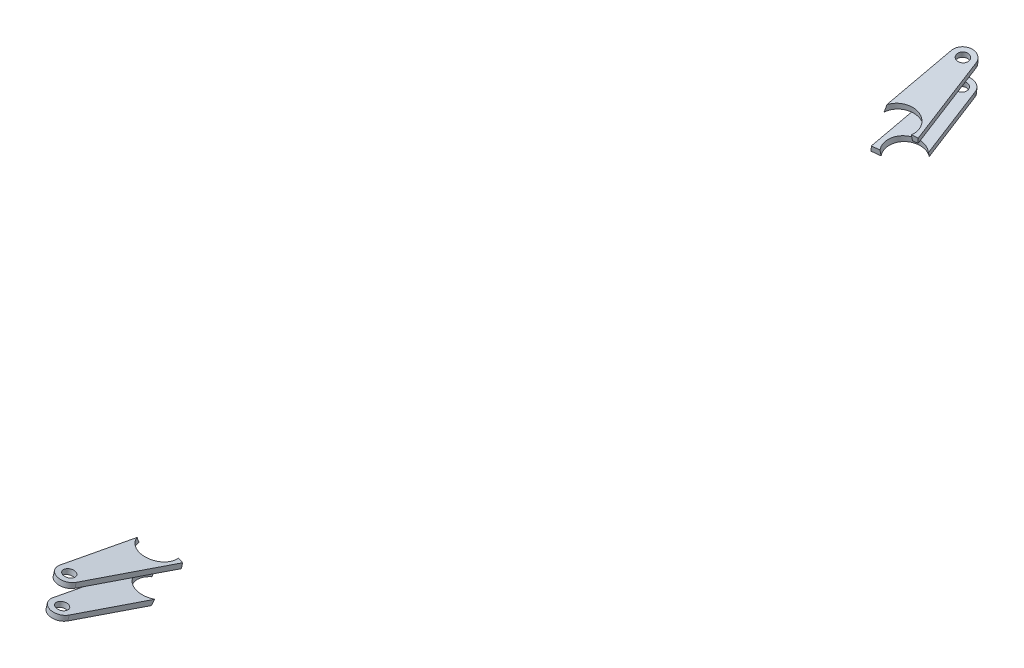
ISO-10303-21;
HEADER;
FILE_DESCRIPTION(('STEP AP214'),'2;1');
FILE_NAME('part.step','',(''),(''),'','','');
FILE_SCHEMA(('AUTOMOTIVE_DESIGN { 1 0 10303 214 1 1 1 1 }'));
ENDSEC;
DATA;
#1=APPLICATION_CONTEXT('core data for automotive mechanical design processes');
#2=APPLICATION_PROTOCOL_DEFINITION('international standard','automotive_design',2000,#1);
#3=PRODUCT_CONTEXT('',#1,'mechanical');
#4=PRODUCT('Part','Part','',(#3));
#5=PRODUCT_RELATED_PRODUCT_CATEGORY('part','',(#4));
#6=PRODUCT_DEFINITION_FORMATION('','',#4);
#7=PRODUCT_DEFINITION_CONTEXT('part definition',#1,'design');
#8=PRODUCT_DEFINITION('design','',#6,#7);
#9=PRODUCT_DEFINITION_SHAPE('','',#8);
#10=(LENGTH_UNIT() NAMED_UNIT(*) SI_UNIT(.MILLI.,.METRE.));
#11=(NAMED_UNIT(*) PLANE_ANGLE_UNIT() SI_UNIT($,.RADIAN.));
#12=(NAMED_UNIT(*) SI_UNIT($,.STERADIAN.) SOLID_ANGLE_UNIT());
#13=UNCERTAINTY_MEASURE_WITH_UNIT(LENGTH_MEASURE(1.E-05),#10,'distance_accuracy_value','');
#14=(GEOMETRIC_REPRESENTATION_CONTEXT(3) GLOBAL_UNCERTAINTY_ASSIGNED_CONTEXT((#13)) GLOBAL_UNIT_ASSIGNED_CONTEXT((#10,
#11,#12)) REPRESENTATION_CONTEXT('',''));
#15=CARTESIAN_POINT('',(0.,0.,0.));
#16=DIRECTION('',(0.,0.,1.));
#17=DIRECTION('',(1.,0.,0.));
#18=AXIS2_PLACEMENT_3D('',#15,#16,#17);
#19=CARTESIAN_POINT('',(-315.898608154601,39.6207972962913,-98.9370051373179));
#20=DIRECTION('',(0.949587650168119,-0.105104387132738,0.295358024190373));
#21=DIRECTION('',(-0.257678722373041,0.274943604623151,0.926287045312103));
#22=AXIS2_PLACEMENT_3D('',#19,#20,#21);
#23=PLANE('',#22);
#24=DIRECTION('',(0.280083660283906,-0.138831331262688,-0.949883679563872));
#25=VECTOR('',#24,1.);
#26=CARTESIAN_POINT('',(-315.33524059586,43.5596883671696,-99.3465831219716));
#27=LINE('',#26,#25);
#28=CARTESIAN_POINT('',(-444.781285392528,107.723255451357,339.660409330972));
#29=VERTEX_POINT('',#28);
#30=CARTESIAN_POINT('',(-430.15979927421,100.475705270145,290.072686074704));
#31=VERTEX_POINT('',#30);
#32=EDGE_CURVE('E53',#29,#31,#27,.T.);
#33=ORIENTED_EDGE('',*,*,#32,.F.);
#34=DIRECTION('',(0.140841889685417,0.984722767719566,-0.102394496163414));
#35=VECTOR('',#34,1.);
#36=CARTESIAN_POINT('',(-445.34465295127,103.784364380478,340.069987315625));
#37=LINE('',#36,#35);
#38=CARTESIAN_POINT('',(-445.34465295127,103.784364380478,340.069987315625));
#39=VERTEX_POINT('',#38);
#40=EDGE_CURVE('E123',#39,#29,#37,.T.);
#41=ORIENTED_EDGE('',*,*,#40,.F.);
#42=DIRECTION('',(0.280083660283906,-0.138831331262688,-0.949883679563872));
#43=VECTOR('',#42,1.);
#44=CARTESIAN_POINT('',(-315.898608154601,39.6207972962913,-98.9370051373179));
#45=LINE('',#44,#43);
#46=CARTESIAN_POINT('',(-431.055779689559,96.7016831017622,291.610296747108));
#47=VERTEX_POINT('',#46);
#48=EDGE_CURVE('E113',#39,#47,#45,.T.);
#49=ORIENTED_EDGE('',*,*,#48,.T.);
#50=CARTESIAN_POINT('',(-435.615739093965,47.9161448269677,288.910207701595));
#51=DIRECTION('',(-0.949587650168119,0.105104387132738,-0.295358024190373));
#52=DIRECTION('',(-0.139095636690416,-0.985567914832191,0.0964794750556549));
#53=AXIS2_PLACEMENT_3D('',#50,#51,#52);
#54=ELLIPSE('',#53,61.2064689207958,12.7);
#55=EDGE_CURVE('E121',#31,#47,#54,.F.);
#56=ORIENTED_EDGE('',*,*,#55,.F.);
#57=EDGE_LOOP('',(#33,#41,#49,#56));
#58=FACE_BOUND('',#57,.T.);
#59=ADVANCED_FACE('F50',(#58),#23,.T.);
#60=CARTESIAN_POINT('',(-452.941354152615,104.62519947754,337.707123122102));
#61=DIRECTION('',(0.140841889685417,0.984722767719566,-0.102394496163414));
#62=DIRECTION('',(0.989925947061876,-0.141586084533923,0.));
#63=AXIS2_PLACEMENT_3D('',#60,#61,#62);
#64=CYLINDRICAL_SURFACE('',#63,7.99999999999992);
#65=CARTESIAN_POINT('',(-452.377986593873,108.564090548419,337.297545137449));
#66=DIRECTION('',(-0.140841889685417,-0.984722767719566,0.102394496163414));
#67=DIRECTION('',(-0.989925947061876,0.141586084533923,0.));
#68=AXIS2_PLACEMENT_3D('',#65,#66,#67);
#69=CIRCLE('',#68,7.99999999999992);
#70=CARTESIAN_POINT('',(-460.26556189393,109.605071793308,336.459384094617));
#71=VERTEX_POINT('',#70);
#72=EDGE_CURVE('E59',#29,#71,#69,.T.);
#73=ORIENTED_EDGE('',*,*,#72,.T.);
#74=DIRECTION('',(0.140841889685417,0.984722767719566,-0.102394496163414));
#75=VECTOR('',#74,1.);
#76=CARTESIAN_POINT('',(-460.828929452672,105.66618072243,336.868962079271));
#77=LINE('',#76,#75);
#78=CARTESIAN_POINT('',(-460.828929452672,105.66618072243,336.868962079271));
#79=VERTEX_POINT('',#78);
#80=EDGE_CURVE('E128',#79,#71,#77,.T.);
#81=ORIENTED_EDGE('',*,*,#80,.F.);
#82=CARTESIAN_POINT('',(-452.941354152615,104.62519947754,337.707123122102));
#83=DIRECTION('',(-0.140841889685417,-0.984722767719566,0.102394496163414));
#84=DIRECTION('',(-0.989925947061876,0.141586084533923,0.));
#85=AXIS2_PLACEMENT_3D('',#82,#83,#84);
#86=CIRCLE('',#85,7.99999999999992);
#87=EDGE_CURVE('E125',#39,#79,#86,.T.);
#88=ORIENTED_EDGE('',*,*,#87,.F.);
#89=ORIENTED_EDGE('',*,*,#40,.T.);
#90=EDGE_LOOP('',(#73,#81,#88,#89));
#91=FACE_BOUND('',#90,.T.);
#92=ADVANCED_FACE('F143',(#91),#64,.T.);
#93=CARTESIAN_POINT('',(-426.070794455035,60.9014503696764,-45.8219951733365));
#94=DIRECTION('',(-0.985946912507115,0.130122655611153,-0.104770130353974));
#95=DIRECTION('',(0.149343983494927,0.967575544073374,-0.203700616358865));
#96=AXIS2_PLACEMENT_3D('',#93,#94,#95);
#97=PLANE('',#96);
#98=DIRECTION('',(-0.089845688975755,0.115711560491681,0.989211093215726));
#99=VECTOR('',#98,1.);
#100=CARTESIAN_POINT('',(-425.507426896294,64.8403414405546,-46.2315731579901));
#101=LINE('',#100,#99);
#102=CARTESIAN_POINT('',(-454.360943592119,102.000560039887,271.448875611208));
#103=VERTEX_POINT('',#102);
#104=EDGE_CURVE('E135',#103,#71,#101,.T.);
#105=ORIENTED_EDGE('',*,*,#104,.F.);
#106=DIRECTION('',(0.140841889685417,0.984722767719566,-0.102394496163414));
#107=VECTOR('',#106,1.);
#108=CARTESIAN_POINT('',(-454.924311150861,98.0616689690091,271.858453595861));
#109=LINE('',#108,#107);
#110=CARTESIAN_POINT('',(-454.924311150861,98.0616689690091,271.858453595861));
#111=VERTEX_POINT('',#110);
#112=EDGE_CURVE('E106',#111,#103,#109,.T.);
#113=ORIENTED_EDGE('',*,*,#112,.F.);
#114=DIRECTION('',(-0.089845688975755,0.115711560491681,0.989211093215726));
#115=VECTOR('',#114,1.);
#116=CARTESIAN_POINT('',(-426.070794455035,60.9014503696764,-45.8219951733365));
#117=LINE('',#116,#115);
#118=EDGE_CURVE('E119',#111,#79,#117,.T.);
#119=ORIENTED_EDGE('',*,*,#118,.T.);
#120=ORIENTED_EDGE('',*,*,#80,.T.);
#121=EDGE_LOOP('',(#105,#113,#119,#120));
#122=FACE_BOUND('',#121,.T.);
#123=ADVANCED_FACE('F150',(#122),#97,.T.);
#124=CARTESIAN_POINT('',(-79.534245422668,53.653592766412,361.130854569256));
#125=DIRECTION('',(0.214624362612918,-0.131334608901061,-0.967826225867952));
#126=DIRECTION('',(0.943795222181968,-0.227142309163283,0.240118616467904));
#127=AXIS2_PLACEMENT_3D('',#124,#125,#126);
#128=PLANE('',#127);
#129=DIRECTION('',(-0.966488460915514,0.114334121064205,-0.229842910870961));
#130=VECTOR('',#129,1.);
#131=CARTESIAN_POINT('',(-79.534245422668,53.653592766412,361.130854569256));
#132=LINE('',#131,#130);
#133=CARTESIAN_POINT('',(-448.857566342382,97.343982246975,273.301200553203));
#134=VERTEX_POINT('',#133);
#135=EDGE_CURVE('E118',#134,#111,#132,.T.);
#136=ORIENTED_EDGE('',*,*,#135,.T.);
#137=ORIENTED_EDGE('',*,*,#112,.T.);
#138=DIRECTION('',(-0.966488460915514,0.114334121064205,-0.229842910870961));
#139=VECTOR('',#138,1.);
#140=CARTESIAN_POINT('',(-78.9708778639263,57.5924838372903,360.721276584603));
#141=LINE('',#140,#139);
#142=CARTESIAN_POINT('',(-449.129093266095,101.38164007058,272.693074333493));
#143=VERTEX_POINT('',#142);
#144=EDGE_CURVE('E99',#143,#103,#141,.T.);
#145=ORIENTED_EDGE('',*,*,#144,.F.);
#146=CARTESIAN_POINT('',(-479.146522618045,751.888018124931,177.762321337046));
#147=DIRECTION('',(-0.214624362612918,0.131334608901061,0.967826225867952));
#148=DIRECTION('',(0.0627031310183475,-0.987020956273914,0.147844341239783));
#149=AXIS2_PLACEMENT_3D('',#146,#147,#148);
#150=ELLIPSE('',#149,1570.71577182927,12.7);
#151=EDGE_CURVE('E103',#134,#143,#150,.F.);
#152=ORIENTED_EDGE('',*,*,#151,.F.);
#153=EDGE_LOOP('',(#136,#137,#145,#152));
#154=FACE_BOUND('',#153,.T.);
#155=ADVANCED_FACE('F108',(#154),#128,.T.);
#156=CARTESIAN_POINT('',(-452.941354152615,104.62519947754,337.707123122102));
#157=DIRECTION('',(0.140841889685417,0.984722767719566,-0.102394496163414));
#158=DIRECTION('',(0.989925947061876,-0.141586084533923,0.));
#159=AXIS2_PLACEMENT_3D('',#156,#157,#158);
#160=CYLINDRICAL_SURFACE('',#159,4.09999999999997);
#161=CARTESIAN_POINT('',(-452.941354152615,104.62519947754,337.707123122102));
#162=DIRECTION('',(-0.140841889685417,-0.984722767719566,0.102394496163414));
#163=DIRECTION('',(-0.989925947061876,0.141586084533923,0.));
#164=AXIS2_PLACEMENT_3D('',#161,#162,#163);
#165=CIRCLE('',#164,4.09999999999997);
#166=CARTESIAN_POINT('',(-457.000050535569,105.205702424129,337.707123122102));
#167=VERTEX_POINT('',#166);
#168=EDGE_CURVE('E130',#167,#167,#165,.T.);
#169=ORIENTED_EDGE('',*,*,#168,.T.);
#170=EDGE_LOOP('',(#169));
#171=FACE_BOUND('',#170,.T.);
#172=CARTESIAN_POINT('',(-452.377986593873,108.564090548419,337.297545137449));
#173=DIRECTION('',(-0.140841889685417,-0.984722767719566,0.102394496163414));
#174=DIRECTION('',(-0.989925947061876,0.141586084533923,0.));
#175=AXIS2_PLACEMENT_3D('',#172,#173,#174);
#176=CIRCLE('',#175,4.09999999999997);
#177=CARTESIAN_POINT('',(-456.436682976827,109.144593495008,337.297545137449));
#178=VERTEX_POINT('',#177);
#179=EDGE_CURVE('E111',#178,#178,#176,.T.);
#180=ORIENTED_EDGE('',*,*,#179,.F.);
#181=EDGE_LOOP('',(#180));
#182=FACE_BOUND('',#181,.T.);
#183=ADVANCED_FACE('F157',(#171,#182),#160,.F.);
#184=CARTESIAN_POINT('',(0.655527314658292,4.58324347286093,-0.476579725362359));
#185=DIRECTION('',(-0.140841889685417,-0.984722767719566,0.102394496163414));
#186=DIRECTION('',(-0.989925947061876,0.141586084533923,0.));
#187=AXIS2_PLACEMENT_3D('',#184,#185,#186);
#188=PLANE('',#187);
#189=ORIENTED_EDGE('',*,*,#48,.F.);
#190=ORIENTED_EDGE('',*,*,#87,.T.);
#191=ORIENTED_EDGE('',*,*,#118,.F.);
#192=ORIENTED_EDGE('',*,*,#135,.F.);
#193=CARTESIAN_POINT('',(-438.632560681794,96.7036320408156,281.207306079328));
#194=DIRECTION('',(0.140841889685417,0.984722767719566,-0.102394496163414));
#195=DIRECTION('',(0.957395312540033,-0.10913181217031,0.267365785205955));
#196=AXIS2_PLACEMENT_3D('',#193,#194,#195);
#197=ELLIPSE('',#196,12.9828011089612,12.7);
#198=EDGE_CURVE('E68',#47,#134,#197,.F.);
#199=ORIENTED_EDGE('',*,*,#198,.F.);
#200=EDGE_LOOP('',(#189,#190,#191,#192,#199));
#201=FACE_BOUND('',#200,.T.);
#202=ORIENTED_EDGE('',*,*,#168,.F.);
#203=EDGE_LOOP('',(#202));
#204=FACE_BOUND('',#203,.T.);
#205=ADVANCED_FACE('F146',(#201,#204),#188,.T.);
#206=CARTESIAN_POINT('',(1.21889487339996,8.52213454373919,-0.886157710016015));
#207=DIRECTION('',(-0.140841889685417,-0.984722767719566,0.102394496163414));
#208=DIRECTION('',(-0.989925947061876,0.141586084533923,0.));
#209=AXIS2_PLACEMENT_3D('',#206,#207,#208);
#210=PLANE('',#209);
#211=CARTESIAN_POINT('',(-438.881853930867,100.73515689157,280.570781406988));
#212=DIRECTION('',(0.140841889685417,0.984722767719566,-0.102394496163414));
#213=DIRECTION('',(0.957395312540033,-0.10913181217031,0.267365785205955));
#214=AXIS2_PLACEMENT_3D('',#211,#212,#213);
#215=ELLIPSE('',#214,12.9828011089612,12.7);
#216=EDGE_CURVE('E12',#31,#143,#215,.F.);
#217=ORIENTED_EDGE('',*,*,#216,.T.);
#218=ORIENTED_EDGE('',*,*,#144,.T.);
#219=ORIENTED_EDGE('',*,*,#104,.T.);
#220=ORIENTED_EDGE('',*,*,#72,.F.);
#221=ORIENTED_EDGE('',*,*,#32,.T.);
#222=EDGE_LOOP('',(#217,#218,#219,#220,#221));
#223=FACE_BOUND('',#222,.T.);
#224=ORIENTED_EDGE('',*,*,#179,.T.);
#225=EDGE_LOOP('',(#224));
#226=FACE_BOUND('',#225,.T.);
#227=ADVANCED_FACE('F96',(#223,#226),#210,.F.);
#228=CARTESIAN_POINT('',(-454.575221179992,354.525423143221,240.500641187299));
#229=DIRECTION('',(0.0609657391469297,-0.985926788350095,0.155664853656615));
#230=DIRECTION('',(0.,0.155954951815569,0.987764168718528));
#231=AXIS2_PLACEMENT_3D('',#228,#229,#230);
#232=CYLINDRICAL_SURFACE('',#231,12.7);
#233=ORIENTED_EDGE('',*,*,#55,.T.);
#234=ORIENTED_EDGE('',*,*,#198,.T.);
#235=ORIENTED_EDGE('',*,*,#151,.T.);
#236=ORIENTED_EDGE('',*,*,#216,.F.);
#237=EDGE_LOOP('',(#233,#234,#235,#236));
#238=FACE_BOUND('',#237,.T.);
#239=ADVANCED_FACE('F104',(#238),#232,.F.);
#240=CLOSED_SHELL('',(#59,#92,#123,#155,#183,#205,#227,#239));
#241=MANIFOLD_SOLID_BREP('B2',#240);
#242=CARTESIAN_POINT('',(-422.408905323215,86.504242330385,-48.4842520735852));
#243=DIRECTION('',(-0.985946912507115,0.130122655611153,-0.104770130353974));
#244=DIRECTION('',(-0.130842753224598,-0.991403133911028,0.));
#245=AXIS2_PLACEMENT_3D('',#242,#243,#244);
#246=PLANE('',#245);
#247=DIRECTION('',(-0.089845688975755,0.115711560491681,0.989211093215726));
#248=VECTOR('',#247,1.);
#249=CARTESIAN_POINT('',(-422.972272881956,82.5653512595067,-48.0746740889315));
#250=LINE('',#249,#248);
#251=CARTESIAN_POINT('',(-452.700574634865,120.852198695502,279.237256084784));
#252=VERTEX_POINT('',#251);
#253=CARTESIAN_POINT('',(-457.730407879593,127.33008161226,334.616283163676));
#254=VERTEX_POINT('',#253);
#255=EDGE_CURVE('E292',#252,#254,#250,.T.);
#256=ORIENTED_EDGE('',*,*,#255,.T.);
#257=DIRECTION('',(-0.140841889685417,-0.984722767719566,0.102394496163414));
#258=VECTOR('',#257,1.);
#259=CARTESIAN_POINT('',(-457.167040320851,131.268972683138,334.206705179022));
#260=LINE('',#259,#258);
#261=CARTESIAN_POINT('',(-457.167040320851,131.268972683138,334.206705179022));
#262=VERTEX_POINT('',#261);
#263=EDGE_CURVE('E314',#262,#254,#260,.T.);
#264=ORIENTED_EDGE('',*,*,#263,.F.);
#265=DIRECTION('',(-0.089845688975755,0.115711560491681,0.989211093215726));
#266=VECTOR('',#265,1.);
#267=CARTESIAN_POINT('',(-422.408905323215,86.504242330385,-48.4842520735852));
#268=LINE('',#267,#266);
#269=CARTESIAN_POINT('',(-452.336998865046,125.048400049525,281.027408061452));
#270=VERTEX_POINT('',#269);
#271=EDGE_CURVE('E312',#270,#262,#268,.T.);
#272=ORIENTED_EDGE('',*,*,#271,.F.);
#273=CARTESIAN_POINT('',(-443.760652127734,179.634189439226,268.113663393457));
#274=DIRECTION('',(0.985946912507115,-0.130122655611153,0.104770130353974));
#275=DIRECTION('',(-0.14391459231776,-0.980044054259896,0.137121266869286));
#276=AXIS2_PLACEMENT_3D('',#273,#274,#275);
#277=ELLIPSE('',#276,62.0391573764046,12.7);
#278=EDGE_CURVE('E315',#252,#270,#277,.F.);
#279=ORIENTED_EDGE('',*,*,#278,.F.);
#280=EDGE_LOOP('',(#256,#264,#272,#279));
#281=FACE_BOUND('',#280,.T.);
#282=ADVANCED_FACE('F239',(#281),#246,.T.);
#283=CARTESIAN_POINT('',(-312.236719022781,65.223589257,-101.599262037567));
#284=DIRECTION('',(0.949587650168119,-0.105104387132738,0.295358024190373));
#285=DIRECTION('',(-0.297003066342178,0.,0.95487652530751));
#286=AXIS2_PLACEMENT_3D('',#283,#284,#285);
#287=PLANE('',#286);
#288=DIRECTION('',(0.280083660283906,-0.138831331262688,-0.949883679563872));
#289=VECTOR('',#288,1.);
#290=CARTESIAN_POINT('',(-312.800086581522,61.2846981861217,-101.189684052913));
#291=LINE('',#290,#289);
#292=CARTESIAN_POINT('',(-442.246131378191,125.448265270309,337.81730840003));
#293=VERTEX_POINT('',#292);
#294=CARTESIAN_POINT('',(-424.078868108948,116.4431510751,276.204335817834));
#295=VERTEX_POINT('',#294);
#296=EDGE_CURVE('E303',#293,#295,#291,.T.);
#297=ORIENTED_EDGE('',*,*,#296,.T.);
#298=DIRECTION('',(-0.140841889685417,-0.984722767719566,0.102394496163414));
#299=VECTOR('',#298,1.);
#300=CARTESIAN_POINT('',(-423.515500550207,120.382042145978,275.79475783318));
#301=LINE('',#300,#299);
#302=CARTESIAN_POINT('',(-423.515500550207,120.382042145978,275.79475783318));
#303=VERTEX_POINT('',#302);
#304=EDGE_CURVE('E301',#303,#295,#301,.T.);
#305=ORIENTED_EDGE('',*,*,#304,.F.);
#306=DIRECTION('',(0.280083660283906,-0.138831331262688,-0.949883679563872));
#307=VECTOR('',#306,1.);
#308=CARTESIAN_POINT('',(-312.236719022781,65.223589257,-101.599262037567));
#309=LINE('',#308,#307);
#310=CARTESIAN_POINT('',(-441.682763819449,129.387156341187,337.407730415377));
#311=VERTEX_POINT('',#310);
#312=EDGE_CURVE('E317',#311,#303,#309,.T.);
#313=ORIENTED_EDGE('',*,*,#312,.F.);
#314=DIRECTION('',(-0.140841889685417,-0.984722767719566,0.102394496163414));
#315=VECTOR('',#314,1.);
#316=CARTESIAN_POINT('',(-441.682763819449,129.387156341187,337.407730415377));
#317=LINE('',#316,#315);
#318=EDGE_CURVE('E311',#311,#293,#317,.T.);
#319=ORIENTED_EDGE('',*,*,#318,.T.);
#320=EDGE_LOOP('',(#297,#305,#313,#319));
#321=FACE_BOUND('',#320,.T.);
#322=ADVANCED_FACE('F332',(#321),#287,.T.);
#323=CARTESIAN_POINT('',(-449.279465020794,130.227991438249,335.044866221854));
#324=DIRECTION('',(-0.140841889685417,-0.984722767719566,0.102394496163414));
#325=DIRECTION('',(0.989925947061876,-0.141586084533923,0.));
#326=AXIS2_PLACEMENT_3D('',#323,#324,#325);
#327=CYLINDRICAL_SURFACE('',#326,7.99999999999992);
#328=CARTESIAN_POINT('',(-449.842832579536,126.289100367371,335.454444206507));
#329=DIRECTION('',(-0.140841889685417,-0.984722767719566,0.102394496163414));
#330=DIRECTION('',(-0.989925947061876,0.141586084533923,0.));
#331=AXIS2_PLACEMENT_3D('',#328,#329,#330);
#332=CIRCLE('',#331,7.99999999999992);
#333=EDGE_CURVE('E323',#293,#254,#332,.T.);
#334=ORIENTED_EDGE('',*,*,#333,.F.);
#335=ORIENTED_EDGE('',*,*,#318,.F.);
#336=CARTESIAN_POINT('',(-449.279465020794,130.227991438249,335.044866221854));
#337=DIRECTION('',(-0.140841889685417,-0.984722767719566,0.102394496163414));
#338=DIRECTION('',(-0.989925947061876,0.141586084533923,0.));
#339=AXIS2_PLACEMENT_3D('',#336,#337,#338);
#340=CIRCLE('',#339,7.99999999999992);
#341=EDGE_CURVE('E308',#311,#262,#340,.T.);
#342=ORIENTED_EDGE('',*,*,#341,.T.);
#343=ORIENTED_EDGE('',*,*,#263,.T.);
#344=EDGE_LOOP('',(#334,#335,#342,#343));
#345=FACE_BOUND('',#344,.T.);
#346=ADVANCED_FACE('F335',(#345),#327,.T.);
#347=CARTESIAN_POINT('',(-75.8723562908471,79.2563847271208,358.468597669008));
#348=DIRECTION('',(0.214624362612918,-0.131334608901061,-0.967826225867952));
#349=DIRECTION('',(0.976282692867907,0.,0.216499661908714));
#350=AXIS2_PLACEMENT_3D('',#347,#348,#349);
#351=PLANE('',#350);
#352=DIRECTION('',(-0.966488460915514,0.114334121064204,-0.229842910870961));
#353=VECTOR('',#352,1.);
#354=CARTESIAN_POINT('',(-75.8723562908471,79.2563847271208,358.468597669008));
#355=LINE('',#354,#353);
#356=CARTESIAN_POINT('',(-427.688789836657,120.875735947621,274.802298019852));
#357=VERTEX_POINT('',#356);
#358=EDGE_CURVE('E297',#303,#357,#355,.T.);
#359=ORIENTED_EDGE('',*,*,#358,.F.);
#360=ORIENTED_EDGE('',*,*,#304,.T.);
#361=DIRECTION('',(-0.966488460915514,0.114334121064204,-0.229842910870961));
#362=VECTOR('',#361,1.);
#363=CARTESIAN_POINT('',(-76.4357238495888,75.3174936562425,358.878175653661));
#364=LINE('',#363,#362);
#365=CARTESIAN_POINT('',(-427.447029750203,116.841599495778,275.403345317464));
#366=VERTEX_POINT('',#365);
#367=EDGE_CURVE('E289',#295,#366,#364,.T.);
#368=ORIENTED_EDGE('',*,*,#367,.T.);
#369=CARTESIAN_POINT('',(-479.146522618045,751.888018124932,177.762321337046));
#370=DIRECTION('',(-0.214624362612918,0.131334608901061,0.967826225867952));
#371=DIRECTION('',(0.0627031310183475,-0.987020956273914,0.147844341239783));
#372=AXIS2_PLACEMENT_3D('',#369,#370,#371);
#373=ELLIPSE('',#372,1570.71577182926,12.7);
#374=EDGE_CURVE('E294',#357,#366,#373,.F.);
#375=ORIENTED_EDGE('',*,*,#374,.F.);
#376=EDGE_LOOP('',(#359,#360,#368,#375));
#377=FACE_BOUND('',#376,.T.);
#378=ADVANCED_FACE('F299',(#377),#351,.T.);
#379=CARTESIAN_POINT('',(-449.279465020794,130.227991438249,335.044866221854));
#380=DIRECTION('',(-0.140841889685417,-0.984722767719566,0.102394496163414));
#381=DIRECTION('',(0.989925947061876,-0.141586084533923,0.));
#382=AXIS2_PLACEMENT_3D('',#379,#380,#381);
#383=CYLINDRICAL_SURFACE('',#382,4.09999999999997);
#384=CARTESIAN_POINT('',(-449.279465020794,130.227991438249,335.044866221854));
#385=DIRECTION('',(-0.140841889685417,-0.984722767719566,0.102394496163414));
#386=DIRECTION('',(-0.989925947061876,0.141586084533923,0.));
#387=AXIS2_PLACEMENT_3D('',#384,#385,#386);
#388=CIRCLE('',#387,4.09999999999997);
#389=CARTESIAN_POINT('',(-453.338161403748,130.808494384838,335.044866221854));
#390=VERTEX_POINT('',#389);
#391=EDGE_CURVE('E296',#390,#390,#388,.T.);
#392=ORIENTED_EDGE('',*,*,#391,.F.);
#393=EDGE_LOOP('',(#392));
#394=FACE_BOUND('',#393,.T.);
#395=CARTESIAN_POINT('',(-449.842832579536,126.289100367371,335.454444206507));
#396=DIRECTION('',(-0.140841889685417,-0.984722767719566,0.102394496163414));
#397=DIRECTION('',(-0.989925947061876,0.141586084533923,0.));
#398=AXIS2_PLACEMENT_3D('',#395,#396,#397);
#399=CIRCLE('',#398,4.09999999999997);
#400=CARTESIAN_POINT('',(-453.901528962489,126.86960331396,335.454444206507));
#401=VERTEX_POINT('',#400);
#402=EDGE_CURVE('E249',#401,#401,#399,.T.);
#403=ORIENTED_EDGE('',*,*,#402,.T.);
#404=EDGE_LOOP('',(#403));
#405=FACE_BOUND('',#404,.T.);
#406=ADVANCED_FACE('F341',(#394,#405),#383,.F.);
#407=CARTESIAN_POINT('',(4.31741644647915,30.1860354335696,-3.13883662561112));
#408=DIRECTION('',(0.140841889685417,0.984722767719566,-0.102394496163414));
#409=DIRECTION('',(-0.989925947061876,0.141586084533923,0.));
#410=AXIS2_PLACEMENT_3D('',#407,#408,#409);
#411=PLANE('',#410);
#412=ORIENTED_EDGE('',*,*,#271,.T.);
#413=ORIENTED_EDGE('',*,*,#341,.F.);
#414=ORIENTED_EDGE('',*,*,#312,.T.);
#415=ORIENTED_EDGE('',*,*,#358,.T.);
#416=CARTESIAN_POINT('',(-440.252966800766,122.908543570721,277.069895709119));
#417=DIRECTION('',(-0.140841889685417,-0.984722767719566,0.102394496163414));
#418=DIRECTION('',(0.957395312540033,-0.10913181217031,0.267365785205954));
#419=AXIS2_PLACEMENT_3D('',#416,#417,#418);
#420=ELLIPSE('',#419,12.9828011089612,12.7);
#421=EDGE_CURVE('E243',#270,#357,#420,.F.);
#422=ORIENTED_EDGE('',*,*,#421,.F.);
#423=EDGE_LOOP('',(#412,#413,#414,#415,#422));
#424=FACE_BOUND('',#423,.T.);
#425=ORIENTED_EDGE('',*,*,#391,.T.);
#426=EDGE_LOOP('',(#425));
#427=FACE_BOUND('',#426,.T.);
#428=ADVANCED_FACE('F338',(#424,#427),#411,.T.);
#429=CARTESIAN_POINT('',(3.75404888773748,26.2471443626914,-2.72925864095746));
#430=DIRECTION('',(0.140841889685417,0.984722767719566,-0.102394496163414));
#431=DIRECTION('',(-0.989925947061876,0.141586084533923,0.));
#432=AXIS2_PLACEMENT_3D('',#429,#430,#431);
#433=PLANE('',#432);
#434=CARTESIAN_POINT('',(-440.003673551693,118.877018719966,277.706420381459));
#435=DIRECTION('',(-0.140841889685417,-0.984722767719566,0.102394496163414));
#436=DIRECTION('',(0.957395312540033,-0.10913181217031,0.267365785205954));
#437=AXIS2_PLACEMENT_3D('',#434,#435,#436);
#438=ELLIPSE('',#437,12.9828011089612,12.7);
#439=EDGE_CURVE('E48',#252,#366,#438,.F.);
#440=ORIENTED_EDGE('',*,*,#439,.T.);
#441=ORIENTED_EDGE('',*,*,#367,.F.);
#442=ORIENTED_EDGE('',*,*,#296,.F.);
#443=ORIENTED_EDGE('',*,*,#333,.T.);
#444=ORIENTED_EDGE('',*,*,#255,.F.);
#445=EDGE_LOOP('',(#440,#441,#442,#443,#444));
#446=FACE_BOUND('',#445,.T.);
#447=ORIENTED_EDGE('',*,*,#402,.F.);
#448=EDGE_LOOP('',(#447));
#449=FACE_BOUND('',#448,.T.);
#450=ADVANCED_FACE('F285',(#446,#449),#433,.F.);
#451=CARTESIAN_POINT('',(-454.575221179992,354.525423143221,240.500641187299));
#452=DIRECTION('',(0.0609657391469297,-0.985926788350095,0.155664853656615));
#453=DIRECTION('',(0.,0.155954951815569,0.987764168718528));
#454=AXIS2_PLACEMENT_3D('',#451,#452,#453);
#455=CYLINDRICAL_SURFACE('',#454,12.7);
#456=ORIENTED_EDGE('',*,*,#278,.T.);
#457=ORIENTED_EDGE('',*,*,#421,.T.);
#458=ORIENTED_EDGE('',*,*,#374,.T.);
#459=ORIENTED_EDGE('',*,*,#439,.F.);
#460=EDGE_LOOP('',(#456,#457,#458,#459));
#461=FACE_BOUND('',#460,.T.);
#462=ADVANCED_FACE('F241',(#461),#455,.F.);
#463=CLOSED_SHELL('',(#282,#322,#346,#378,#406,#428,#450,#462));
#464=MANIFOLD_SOLID_BREP('B6',#463);
#465=CARTESIAN_POINT('',(-315.898608154601,39.6207972962913,98.9370051373179));
#466=DIRECTION('',(0.949587650168119,-0.105104387132738,-0.295358024190373));
#467=DIRECTION('',(-0.257678722373041,0.274943604623151,-0.926287045312103));
#468=AXIS2_PLACEMENT_3D('',#465,#466,#467);
#469=PLANE('',#468);
#470=DIRECTION('',(0.280083660283906,-0.138831331262688,0.949883679563872));
#471=VECTOR('',#470,1.);
#472=CARTESIAN_POINT('',(-315.33524059586,43.5596883671696,99.3465831219716));
#473=LINE('',#472,#471);
#474=CARTESIAN_POINT('',(-444.781285392528,107.723255451357,-339.660409330972));
#475=VERTEX_POINT('',#474);
#476=CARTESIAN_POINT('',(-430.15979927421,100.475705270145,-290.072686074704));
#477=VERTEX_POINT('',#476);
#478=EDGE_CURVE('E430',#475,#477,#473,.T.);
#479=ORIENTED_EDGE('',*,*,#478,.T.);
#480=CARTESIAN_POINT('',(-435.615739093965,47.9161448269677,-288.910207701595));
#481=DIRECTION('',(0.949587650168119,-0.105104387132738,-0.295358024190373));
#482=DIRECTION('',(-0.139095636690416,-0.985567914832191,-0.0964794750556549));
#483=AXIS2_PLACEMENT_3D('',#480,#481,#482);
#484=ELLIPSE('',#483,61.2064689207958,12.7);
#485=CARTESIAN_POINT('',(-431.055779689559,96.7016831017622,-291.610296747108));
#486=VERTEX_POINT('',#485);
#487=EDGE_CURVE('E467',#477,#486,#484,.F.);
#488=ORIENTED_EDGE('',*,*,#487,.T.);
#489=DIRECTION('',(0.280083660283906,-0.138831331262688,0.949883679563872));
#490=VECTOR('',#489,1.);
#491=CARTESIAN_POINT('',(-315.898608154601,39.6207972962913,98.9370051373179));
#492=LINE('',#491,#490);
#493=CARTESIAN_POINT('',(-445.34465295127,103.784364380478,-340.069987315625));
#494=VERTEX_POINT('',#493);
#495=EDGE_CURVE('E492',#494,#486,#492,.T.);
#496=ORIENTED_EDGE('',*,*,#495,.F.);
#497=DIRECTION('',(0.140841889685417,0.984722767719566,0.102394496163414));
#498=VECTOR('',#497,1.);
#499=CARTESIAN_POINT('',(-445.34465295127,103.784364380478,-340.069987315625));
#500=LINE('',#499,#498);
#501=EDGE_CURVE('E500',#494,#475,#500,.T.);
#502=ORIENTED_EDGE('',*,*,#501,.T.);
#503=EDGE_LOOP('',(#479,#488,#496,#502));
#504=FACE_BOUND('',#503,.T.);
#505=ADVANCED_FACE('F427',(#504),#469,.T.);
#506=CARTESIAN_POINT('',(-452.941354152615,104.62519947754,-337.707123122102));
#507=DIRECTION('',(0.140841889685417,0.984722767719566,0.102394496163414));
#508=DIRECTION('',(0.989925947061876,-0.141586084533923,0.));
#509=AXIS2_PLACEMENT_3D('',#506,#507,#508);
#510=CYLINDRICAL_SURFACE('',#509,7.99999999999992);
#511=CARTESIAN_POINT('',(-452.377986593873,108.564090548419,-337.297545137449));
#512=DIRECTION('',(0.140841889685417,0.984722767719566,0.102394496163414));
#513=DIRECTION('',(-0.989925947061876,0.141586084533923,0.));
#514=AXIS2_PLACEMENT_3D('',#511,#512,#513);
#515=CIRCLE('',#514,7.99999999999992);
#516=CARTESIAN_POINT('',(-460.26556189393,109.605071793308,-336.459384094617));
#517=VERTEX_POINT('',#516);
#518=EDGE_CURVE('E436',#475,#517,#515,.T.);
#519=ORIENTED_EDGE('',*,*,#518,.F.);
#520=ORIENTED_EDGE('',*,*,#501,.F.);
#521=CARTESIAN_POINT('',(-452.941354152615,104.62519947754,-337.707123122102));
#522=DIRECTION('',(0.140841889685417,0.984722767719566,0.102394496163414));
#523=DIRECTION('',(-0.989925947061876,0.141586084533923,0.));
#524=AXIS2_PLACEMENT_3D('',#521,#522,#523);
#525=CIRCLE('',#524,7.99999999999992);
#526=CARTESIAN_POINT('',(-460.828929452672,105.66618072243,-336.868962079271));
#527=VERTEX_POINT('',#526);
#528=EDGE_CURVE('E502',#494,#527,#525,.T.);
#529=ORIENTED_EDGE('',*,*,#528,.T.);
#530=DIRECTION('',(0.140841889685417,0.984722767719566,0.102394496163414));
#531=VECTOR('',#530,1.);
#532=CARTESIAN_POINT('',(-460.828929452672,105.66618072243,-336.868962079271));
#533=LINE('',#532,#531);
#534=EDGE_CURVE('E505',#527,#517,#533,.T.);
#535=ORIENTED_EDGE('',*,*,#534,.T.);
#536=EDGE_LOOP('',(#519,#520,#529,#535));
#537=FACE_BOUND('',#536,.T.);
#538=ADVANCED_FACE('F520',(#537),#510,.T.);
#539=CARTESIAN_POINT('',(-426.070794455035,60.9014503696764,45.8219951733365));
#540=DIRECTION('',(-0.985946912507115,0.130122655611153,0.104770130353974));
#541=DIRECTION('',(0.149343983494927,0.967575544073374,0.203700616358865));
#542=AXIS2_PLACEMENT_3D('',#539,#540,#541);
#543=PLANE('',#542);
#544=DIRECTION('',(-0.089845688975755,0.115711560491681,-0.989211093215726));
#545=VECTOR('',#544,1.);
#546=CARTESIAN_POINT('',(-425.507426896294,64.8403414405546,46.2315731579901));
#547=LINE('',#546,#545);
#548=CARTESIAN_POINT('',(-454.360943592119,102.000560039887,-271.448875611208));
#549=VERTEX_POINT('',#548);
#550=EDGE_CURVE('E489',#549,#517,#547,.T.);
#551=ORIENTED_EDGE('',*,*,#550,.T.);
#552=ORIENTED_EDGE('',*,*,#534,.F.);
#553=DIRECTION('',(-0.089845688975755,0.115711560491681,-0.989211093215726));
#554=VECTOR('',#553,1.);
#555=CARTESIAN_POINT('',(-426.070794455035,60.9014503696764,45.8219951733365));
#556=LINE('',#555,#554);
#557=CARTESIAN_POINT('',(-454.924311150861,98.0616689690091,-271.858453595861));
#558=VERTEX_POINT('',#557);
#559=EDGE_CURVE('E497',#558,#527,#556,.T.);
#560=ORIENTED_EDGE('',*,*,#559,.F.);
#561=DIRECTION('',(0.140841889685417,0.984722767719566,0.102394496163414));
#562=VECTOR('',#561,1.);
#563=CARTESIAN_POINT('',(-454.924311150861,98.0616689690091,-271.858453595861));
#564=LINE('',#563,#562);
#565=EDGE_CURVE('E483',#558,#549,#564,.T.);
#566=ORIENTED_EDGE('',*,*,#565,.T.);
#567=EDGE_LOOP('',(#551,#552,#560,#566));
#568=FACE_BOUND('',#567,.T.);
#569=ADVANCED_FACE('F524',(#568),#543,.T.);
#570=CARTESIAN_POINT('',(-79.534245422668,53.653592766412,-361.130854569256));
#571=DIRECTION('',(0.214624362612918,-0.131334608901061,0.967826225867952));
#572=DIRECTION('',(0.943795222181968,-0.227142309163283,-0.240118616467904));
#573=AXIS2_PLACEMENT_3D('',#570,#571,#572);
#574=PLANE('',#573);
#575=DIRECTION('',(-0.966488460915514,0.114334121064205,0.229842910870961));
#576=VECTOR('',#575,1.);
#577=CARTESIAN_POINT('',(-79.534245422668,53.653592766412,-361.130854569256));
#578=LINE('',#577,#576);
#579=CARTESIAN_POINT('',(-448.857566342382,97.343982246975,-273.301200553203));
#580=VERTEX_POINT('',#579);
#581=EDGE_CURVE('E482',#580,#558,#578,.T.);
#582=ORIENTED_EDGE('',*,*,#581,.F.);
#583=CARTESIAN_POINT('',(-479.146522618045,751.888018124931,-177.762321337046));
#584=DIRECTION('',(0.214624362612918,-0.131334608901061,0.967826225867952));
#585=DIRECTION('',(0.0627031310183475,-0.987020956273914,-0.147844341239783));
#586=AXIS2_PLACEMENT_3D('',#583,#584,#585);
#587=ELLIPSE('',#586,1570.71577182927,12.7);
#588=CARTESIAN_POINT('',(-449.129093266095,101.38164007058,-272.693074333493));
#589=VERTEX_POINT('',#588);
#590=EDGE_CURVE('E471',#580,#589,#587,.F.);
#591=ORIENTED_EDGE('',*,*,#590,.T.);
#592=DIRECTION('',(-0.966488460915514,0.114334121064205,0.229842910870961));
#593=VECTOR('',#592,1.);
#594=CARTESIAN_POINT('',(-78.9708778639263,57.5924838372903,-360.721276584603));
#595=LINE('',#594,#593);
#596=EDGE_CURVE('E480',#589,#549,#595,.T.);
#597=ORIENTED_EDGE('',*,*,#596,.T.);
#598=ORIENTED_EDGE('',*,*,#565,.F.);
#599=EDGE_LOOP('',(#582,#591,#597,#598));
#600=FACE_BOUND('',#599,.T.);
#601=ADVANCED_FACE('F478',(#600),#574,.T.);
#602=CARTESIAN_POINT('',(-452.941354152615,104.62519947754,-337.707123122102));
#603=DIRECTION('',(0.140841889685417,0.984722767719566,0.102394496163414));
#604=DIRECTION('',(0.989925947061876,-0.141586084533923,0.));
#605=AXIS2_PLACEMENT_3D('',#602,#603,#604);
#606=CYLINDRICAL_SURFACE('',#605,4.09999999999997);
#607=CARTESIAN_POINT('',(-452.941354152615,104.62519947754,-337.707123122102));
#608=DIRECTION('',(0.140841889685417,0.984722767719566,0.102394496163414));
#609=DIRECTION('',(-0.989925947061876,0.141586084533923,0.));
#610=AXIS2_PLACEMENT_3D('',#607,#608,#609);
#611=CIRCLE('',#610,4.09999999999997);
#612=CARTESIAN_POINT('',(-457.000050535569,105.205702424129,-337.707123122102));
#613=VERTEX_POINT('',#612);
#614=EDGE_CURVE('E507',#613,#613,#611,.T.);
#615=ORIENTED_EDGE('',*,*,#614,.F.);
#616=EDGE_LOOP('',(#615));
#617=FACE_BOUND('',#616,.T.);
#618=CARTESIAN_POINT('',(-452.377986593873,108.564090548419,-337.297545137449));
#619=DIRECTION('',(0.140841889685417,0.984722767719566,0.102394496163414));
#620=DIRECTION('',(-0.989925947061876,0.141586084533923,0.));
#621=AXIS2_PLACEMENT_3D('',#618,#619,#620);
#622=CIRCLE('',#621,4.09999999999997);
#623=CARTESIAN_POINT('',(-456.436682976827,109.144593495008,-337.297545137449));
#624=VERTEX_POINT('',#623);
#625=EDGE_CURVE('E490',#624,#624,#622,.T.);
#626=ORIENTED_EDGE('',*,*,#625,.T.);
#627=EDGE_LOOP('',(#626));
#628=FACE_BOUND('',#627,.T.);
#629=ADVANCED_FACE('F529',(#617,#628),#606,.F.);
#630=CARTESIAN_POINT('',(0.655527314658292,4.58324347286093,0.476579725362359));
#631=DIRECTION('',(-0.140841889685417,-0.984722767719566,-0.102394496163414));
#632=DIRECTION('',(-0.989925947061876,0.141586084533923,0.));
#633=AXIS2_PLACEMENT_3D('',#630,#631,#632);
#634=PLANE('',#633);
#635=ORIENTED_EDGE('',*,*,#495,.T.);
#636=CARTESIAN_POINT('',(-438.632560681794,96.7036320408156,-281.207306079328));
#637=DIRECTION('',(-0.140841889685417,-0.984722767719566,-0.102394496163414));
#638=DIRECTION('',(0.957395312540033,-0.10913181217031,-0.267365785205955));
#639=AXIS2_PLACEMENT_3D('',#636,#637,#638);
#640=ELLIPSE('',#639,12.9828011089612,12.7);
#641=EDGE_CURVE('E445',#486,#580,#640,.F.);
#642=ORIENTED_EDGE('',*,*,#641,.T.);
#643=ORIENTED_EDGE('',*,*,#581,.T.);
#644=ORIENTED_EDGE('',*,*,#559,.T.);
#645=ORIENTED_EDGE('',*,*,#528,.F.);
#646=EDGE_LOOP('',(#635,#642,#643,#644,#645));
#647=FACE_BOUND('',#646,.T.);
#648=ORIENTED_EDGE('',*,*,#614,.T.);
#649=EDGE_LOOP('',(#648));
#650=FACE_BOUND('',#649,.T.);
#651=ADVANCED_FACE('F526',(#647,#650),#634,.T.);
#652=CARTESIAN_POINT('',(1.21889487339996,8.52213454373919,0.886157710016015));
#653=DIRECTION('',(-0.140841889685417,-0.984722767719566,-0.102394496163414));
#654=DIRECTION('',(-0.989925947061876,0.141586084533923,0.));
#655=AXIS2_PLACEMENT_3D('',#652,#653,#654);
#656=PLANE('',#655);
#657=CARTESIAN_POINT('',(-438.881853930867,100.73515689157,-280.570781406988));
#658=DIRECTION('',(-0.140841889685417,-0.984722767719566,-0.102394496163414));
#659=DIRECTION('',(0.957395312540033,-0.10913181217031,-0.267365785205955));
#660=AXIS2_PLACEMENT_3D('',#657,#658,#659);
#661=ELLIPSE('',#660,12.9828011089612,12.7);
#662=EDGE_CURVE('E237',#477,#589,#661,.F.);
#663=ORIENTED_EDGE('',*,*,#662,.F.);
#664=ORIENTED_EDGE('',*,*,#478,.F.);
#665=ORIENTED_EDGE('',*,*,#518,.T.);
#666=ORIENTED_EDGE('',*,*,#550,.F.);
#667=ORIENTED_EDGE('',*,*,#596,.F.);
#668=EDGE_LOOP('',(#663,#664,#665,#666,#667));
#669=FACE_BOUND('',#668,.T.);
#670=ORIENTED_EDGE('',*,*,#625,.F.);
#671=EDGE_LOOP('',(#670));
#672=FACE_BOUND('',#671,.T.);
#673=ADVANCED_FACE('F486',(#669,#672),#656,.F.);
#674=CARTESIAN_POINT('',(-454.575221179992,354.525423143221,-240.500641187299));
#675=DIRECTION('',(0.0609657391469297,-0.985926788350095,-0.155664853656615));
#676=DIRECTION('',(0.,0.155954951815569,-0.987764168718528));
#677=AXIS2_PLACEMENT_3D('',#674,#675,#676);
#678=CYLINDRICAL_SURFACE('',#677,12.7);
#679=ORIENTED_EDGE('',*,*,#487,.F.);
#680=ORIENTED_EDGE('',*,*,#662,.T.);
#681=ORIENTED_EDGE('',*,*,#590,.F.);
#682=ORIENTED_EDGE('',*,*,#641,.F.);
#683=EDGE_LOOP('',(#679,#680,#681,#682));
#684=FACE_BOUND('',#683,.T.);
#685=ADVANCED_FACE('F470',(#684),#678,.F.);
#686=CLOSED_SHELL('',(#505,#538,#569,#601,#629,#651,#673,#685));
#687=MANIFOLD_SOLID_BREP('B42',#686);
#688=CARTESIAN_POINT('',(-422.408905323215,86.504242330385,48.4842520735852));
#689=DIRECTION('',(-0.985946912507115,0.130122655611153,0.104770130353974));
#690=DIRECTION('',(-0.130842753224598,-0.991403133911028,0.));
#691=AXIS2_PLACEMENT_3D('',#688,#689,#690);
#692=PLANE('',#691);
#693=DIRECTION('',(-0.089845688975755,0.115711560491681,-0.989211093215726));
#694=VECTOR('',#693,1.);
#695=CARTESIAN_POINT('',(-422.972272881956,82.5653512595067,48.0746740889315));
#696=LINE('',#695,#694);
#697=CARTESIAN_POINT('',(-452.700574634865,120.852198695502,-279.237256084784));
#698=VERTEX_POINT('',#697);
#699=CARTESIAN_POINT('',(-457.730407879593,127.33008161226,-334.616283163676));
#700=VERTEX_POINT('',#699);
#701=EDGE_CURVE('E670',#698,#700,#696,.T.);
#702=ORIENTED_EDGE('',*,*,#701,.F.);
#703=CARTESIAN_POINT('',(-443.760652127734,179.634189439226,-268.113663393457));
#704=DIRECTION('',(-0.985946912507115,0.130122655611153,0.104770130353974));
#705=DIRECTION('',(-0.14391459231776,-0.980044054259896,-0.137121266869286));
#706=AXIS2_PLACEMENT_3D('',#703,#704,#705);
#707=ELLIPSE('',#706,62.0391573764046,12.7);
#708=CARTESIAN_POINT('',(-452.336998865046,125.048400049525,-281.027408061452));
#709=VERTEX_POINT('',#708);
#710=EDGE_CURVE('E646',#698,#709,#707,.F.);
#711=ORIENTED_EDGE('',*,*,#710,.T.);
#712=DIRECTION('',(-0.089845688975755,0.115711560491681,-0.989211093215726));
#713=VECTOR('',#712,1.);
#714=CARTESIAN_POINT('',(-422.408905323215,86.504242330385,48.4842520735852));
#715=LINE('',#714,#713);
#716=CARTESIAN_POINT('',(-457.167040320851,131.268972683138,-334.206705179022));
#717=VERTEX_POINT('',#716);
#718=EDGE_CURVE('E677',#709,#717,#715,.T.);
#719=ORIENTED_EDGE('',*,*,#718,.T.);
#720=DIRECTION('',(-0.140841889685417,-0.984722767719566,-0.102394496163414));
#721=VECTOR('',#720,1.);
#722=CARTESIAN_POINT('',(-457.167040320851,131.268972683138,-334.206705179022));
#723=LINE('',#722,#721);
#724=EDGE_CURVE('E679',#717,#700,#723,.T.);
#725=ORIENTED_EDGE('',*,*,#724,.T.);
#726=EDGE_LOOP('',(#702,#711,#719,#725));
#727=FACE_BOUND('',#726,.T.);
#728=ADVANCED_FACE('F606',(#727),#692,.T.);
#729=CARTESIAN_POINT('',(-312.236719022781,65.223589257,101.599262037567));
#730=DIRECTION('',(0.949587650168119,-0.105104387132738,-0.295358024190373));
#731=DIRECTION('',(-0.297003066342178,0.,-0.95487652530751));
#732=AXIS2_PLACEMENT_3D('',#729,#730,#731);
#733=PLANE('',#732);
#734=DIRECTION('',(0.280083660283906,-0.138831331262688,0.949883679563872));
#735=VECTOR('',#734,1.);
#736=CARTESIAN_POINT('',(-312.800086581522,61.2846981861217,101.189684052913));
#737=LINE('',#736,#735);
#738=CARTESIAN_POINT('',(-442.246131378191,125.448265270309,-337.81730840003));
#739=VERTEX_POINT('',#738);
#740=CARTESIAN_POINT('',(-424.078868108948,116.4431510751,-276.204335817834));
#741=VERTEX_POINT('',#740);
#742=EDGE_CURVE('E667',#739,#741,#737,.T.);
#743=ORIENTED_EDGE('',*,*,#742,.F.);
#744=DIRECTION('',(-0.140841889685417,-0.984722767719566,-0.102394496163414));
#745=VECTOR('',#744,1.);
#746=CARTESIAN_POINT('',(-441.682763819449,129.387156341187,-337.407730415377));
#747=LINE('',#746,#745);
#748=CARTESIAN_POINT('',(-441.682763819449,129.387156341187,-337.407730415377));
#749=VERTEX_POINT('',#748);
#750=EDGE_CURVE('E676',#749,#739,#747,.T.);
#751=ORIENTED_EDGE('',*,*,#750,.F.);
#752=DIRECTION('',(0.280083660283906,-0.138831331262688,0.949883679563872));
#753=VECTOR('',#752,1.);
#754=CARTESIAN_POINT('',(-312.236719022781,65.223589257,101.599262037567));
#755=LINE('',#754,#753);
#756=CARTESIAN_POINT('',(-423.515500550207,120.382042145978,-275.79475783318));
#757=VERTEX_POINT('',#756);
#758=EDGE_CURVE('E681',#749,#757,#755,.T.);
#759=ORIENTED_EDGE('',*,*,#758,.T.);
#760=DIRECTION('',(-0.140841889685417,-0.984722767719566,-0.102394496163414));
#761=VECTOR('',#760,1.);
#762=CARTESIAN_POINT('',(-423.515500550207,120.382042145978,-275.79475783318));
#763=LINE('',#762,#761);
#764=EDGE_CURVE('E684',#757,#741,#763,.T.);
#765=ORIENTED_EDGE('',*,*,#764,.T.);
#766=EDGE_LOOP('',(#743,#751,#759,#765));
#767=FACE_BOUND('',#766,.T.);
#768=ADVANCED_FACE('F701',(#767),#733,.T.);
#769=CARTESIAN_POINT('',(-449.279465020794,130.227991438249,-335.044866221854));
#770=DIRECTION('',(-0.140841889685417,-0.984722767719566,-0.102394496163414));
#771=DIRECTION('',(0.989925947061876,-0.141586084533923,0.));
#772=AXIS2_PLACEMENT_3D('',#769,#770,#771);
#773=CYLINDRICAL_SURFACE('',#772,7.99999999999992);
#774=CARTESIAN_POINT('',(-449.842832579536,126.289100367371,-335.454444206507));
#775=DIRECTION('',(0.140841889685417,0.984722767719566,0.102394496163414));
#776=DIRECTION('',(-0.989925947061876,0.141586084533923,0.));
#777=AXIS2_PLACEMENT_3D('',#774,#775,#776);
#778=CIRCLE('',#777,7.99999999999992);
#779=EDGE_CURVE('E689',#739,#700,#778,.T.);
#780=ORIENTED_EDGE('',*,*,#779,.T.);
#781=ORIENTED_EDGE('',*,*,#724,.F.);
#782=CARTESIAN_POINT('',(-449.279465020794,130.227991438249,-335.044866221854));
#783=DIRECTION('',(0.140841889685417,0.984722767719566,0.102394496163414));
#784=DIRECTION('',(-0.989925947061876,0.141586084533923,0.));
#785=AXIS2_PLACEMENT_3D('',#782,#783,#784);
#786=CIRCLE('',#785,7.99999999999992);
#787=EDGE_CURVE('E673',#749,#717,#786,.T.);
#788=ORIENTED_EDGE('',*,*,#787,.F.);
#789=ORIENTED_EDGE('',*,*,#750,.T.);
#790=EDGE_LOOP('',(#780,#781,#788,#789));
#791=FACE_BOUND('',#790,.T.);
#792=ADVANCED_FACE('F697',(#791),#773,.T.);
#793=CARTESIAN_POINT('',(-75.8723562908471,79.2563847271208,-358.468597669008));
#794=DIRECTION('',(0.214624362612918,-0.131334608901061,0.967826225867952));
#795=DIRECTION('',(0.976282692867907,0.,-0.216499661908714));
#796=AXIS2_PLACEMENT_3D('',#793,#794,#795);
#797=PLANE('',#796);
#798=DIRECTION('',(-0.966488460915514,0.114334121064204,0.229842910870961));
#799=VECTOR('',#798,1.);
#800=CARTESIAN_POINT('',(-75.8723562908471,79.2563847271208,-358.468597669008));
#801=LINE('',#800,#799);
#802=CARTESIAN_POINT('',(-427.688789836657,120.875735947621,-274.802298019852));
#803=VERTEX_POINT('',#802);
#804=EDGE_CURVE('E659',#757,#803,#801,.T.);
#805=ORIENTED_EDGE('',*,*,#804,.T.);
#806=CARTESIAN_POINT('',(-479.146522618045,751.888018124932,-177.762321337046));
#807=DIRECTION('',(0.214624362612918,-0.131334608901061,0.967826225867952));
#808=DIRECTION('',(0.0627031310183475,-0.987020956273914,-0.147844341239783));
#809=AXIS2_PLACEMENT_3D('',#806,#807,#808);
#810=ELLIPSE('',#809,1570.71577182926,12.7);
#811=CARTESIAN_POINT('',(-427.447029750203,116.841599495778,-275.403345317464));
#812=VERTEX_POINT('',#811);
#813=EDGE_CURVE('E649',#803,#812,#810,.F.);
#814=ORIENTED_EDGE('',*,*,#813,.T.);
#815=DIRECTION('',(-0.966488460915514,0.114334121064204,0.229842910870961));
#816=VECTOR('',#815,1.);
#817=CARTESIAN_POINT('',(-76.4357238495888,75.3174936562425,-358.878175653661));
#818=LINE('',#817,#816);
#819=EDGE_CURVE('E657',#741,#812,#818,.T.);
#820=ORIENTED_EDGE('',*,*,#819,.F.);
#821=ORIENTED_EDGE('',*,*,#764,.F.);
#822=EDGE_LOOP('',(#805,#814,#820,#821));
#823=FACE_BOUND('',#822,.T.);
#824=ADVANCED_FACE('F656',(#823),#797,.T.);
#825=CARTESIAN_POINT('',(-449.279465020794,130.227991438249,-335.044866221854));
#826=DIRECTION('',(-0.140841889685417,-0.984722767719566,-0.102394496163414));
#827=DIRECTION('',(0.989925947061876,-0.141586084533923,0.));
#828=AXIS2_PLACEMENT_3D('',#825,#826,#827);
#829=CYLINDRICAL_SURFACE('',#828,4.09999999999997);
#830=CARTESIAN_POINT('',(-449.279465020794,130.227991438249,-335.044866221854));
#831=DIRECTION('',(0.140841889685417,0.984722767719566,0.102394496163414));
#832=DIRECTION('',(-0.989925947061876,0.141586084533923,0.));
#833=AXIS2_PLACEMENT_3D('',#830,#831,#832);
#834=CIRCLE('',#833,4.09999999999997);
#835=CARTESIAN_POINT('',(-453.338161403748,130.808494384838,-335.044866221854));
#836=VERTEX_POINT('',#835);
#837=EDGE_CURVE('E660',#836,#836,#834,.T.);
#838=ORIENTED_EDGE('',*,*,#837,.T.);
#839=EDGE_LOOP('',(#838));
#840=FACE_BOUND('',#839,.T.);
#841=CARTESIAN_POINT('',(-449.842832579536,126.289100367371,-335.454444206507));
#842=DIRECTION('',(0.140841889685417,0.984722767719566,0.102394496163414));
#843=DIRECTION('',(-0.989925947061876,0.141586084533923,0.));
#844=AXIS2_PLACEMENT_3D('',#841,#842,#843);
#845=CIRCLE('',#844,4.09999999999997);
#846=CARTESIAN_POINT('',(-453.901528962489,126.86960331396,-335.454444206507));
#847=VERTEX_POINT('',#846);
#848=EDGE_CURVE('E616',#847,#847,#845,.T.);
#849=ORIENTED_EDGE('',*,*,#848,.F.);
#850=EDGE_LOOP('',(#849));
#851=FACE_BOUND('',#850,.T.);
#852=ADVANCED_FACE('F715',(#840,#851),#829,.F.);
#853=CARTESIAN_POINT('',(4.31741644647915,30.1860354335696,3.13883662561112));
#854=DIRECTION('',(0.140841889685417,0.984722767719566,0.102394496163414));
#855=DIRECTION('',(-0.989925947061876,0.141586084533923,0.));
#856=AXIS2_PLACEMENT_3D('',#853,#854,#855);
#857=PLANE('',#856);
#858=ORIENTED_EDGE('',*,*,#718,.F.);
#859=CARTESIAN_POINT('',(-440.252966800766,122.908543570721,-277.069895709119));
#860=DIRECTION('',(0.140841889685417,0.984722767719566,0.102394496163414));
#861=DIRECTION('',(0.957395312540033,-0.10913181217031,-0.267365785205954));
#862=AXIS2_PLACEMENT_3D('',#859,#860,#861);
#863=ELLIPSE('',#862,12.9828011089612,12.7);
#864=EDGE_CURVE('E610',#709,#803,#863,.F.);
#865=ORIENTED_EDGE('',*,*,#864,.T.);
#866=ORIENTED_EDGE('',*,*,#804,.F.);
#867=ORIENTED_EDGE('',*,*,#758,.F.);
#868=ORIENTED_EDGE('',*,*,#787,.T.);
#869=EDGE_LOOP('',(#858,#865,#866,#867,#868));
#870=FACE_BOUND('',#869,.T.);
#871=ORIENTED_EDGE('',*,*,#837,.F.);
#872=EDGE_LOOP('',(#871));
#873=FACE_BOUND('',#872,.T.);
#874=ADVANCED_FACE('F704',(#870,#873),#857,.T.);
#875=CARTESIAN_POINT('',(3.75404888773748,26.2471443626914,2.72925864095746));
#876=DIRECTION('',(0.140841889685417,0.984722767719566,0.102394496163414));
#877=DIRECTION('',(-0.989925947061876,0.141586084533923,0.));
#878=AXIS2_PLACEMENT_3D('',#875,#876,#877);
#879=PLANE('',#878);
#880=CARTESIAN_POINT('',(-440.003673551693,118.877018719966,-277.706420381459));
#881=DIRECTION('',(0.140841889685417,0.984722767719566,0.102394496163414));
#882=DIRECTION('',(0.957395312540033,-0.10913181217031,-0.267365785205954));
#883=AXIS2_PLACEMENT_3D('',#880,#881,#882);
#884=ELLIPSE('',#883,12.9828011089612,12.7);
#885=EDGE_CURVE('E425',#698,#812,#884,.F.);
#886=ORIENTED_EDGE('',*,*,#885,.F.);
#887=ORIENTED_EDGE('',*,*,#701,.T.);
#888=ORIENTED_EDGE('',*,*,#779,.F.);
#889=ORIENTED_EDGE('',*,*,#742,.T.);
#890=ORIENTED_EDGE('',*,*,#819,.T.);
#891=EDGE_LOOP('',(#886,#887,#888,#889,#890));
#892=FACE_BOUND('',#891,.T.);
#893=ORIENTED_EDGE('',*,*,#848,.T.);
#894=EDGE_LOOP('',(#893));
#895=FACE_BOUND('',#894,.T.);
#896=ADVANCED_FACE('F663',(#892,#895),#879,.F.);
#897=CARTESIAN_POINT('',(-454.575221179992,354.525423143221,-240.500641187299));
#898=DIRECTION('',(0.0609657391469297,-0.985926788350095,-0.155664853656615));
#899=DIRECTION('',(0.,0.155954951815569,-0.987764168718528));
#900=AXIS2_PLACEMENT_3D('',#897,#898,#899);
#901=CYLINDRICAL_SURFACE('',#900,12.7);
#902=ORIENTED_EDGE('',*,*,#710,.F.);
#903=ORIENTED_EDGE('',*,*,#885,.T.);
#904=ORIENTED_EDGE('',*,*,#813,.F.);
#905=ORIENTED_EDGE('',*,*,#864,.F.);
#906=EDGE_LOOP('',(#902,#903,#904,#905));
#907=FACE_BOUND('',#906,.T.);
#908=ADVANCED_FACE('F608',(#907),#901,.F.);
#909=CLOSED_SHELL('',(#728,#768,#792,#824,#852,#874,#896,#908));
#910=MANIFOLD_SOLID_BREP('B231',#909);
#911=ADVANCED_BREP_SHAPE_REPRESENTATION('',(#18,#241,#464,#687,#910),#14);
#912=SHAPE_DEFINITION_REPRESENTATION(#9,#911);
ENDSEC;
END-ISO-10303-21;
